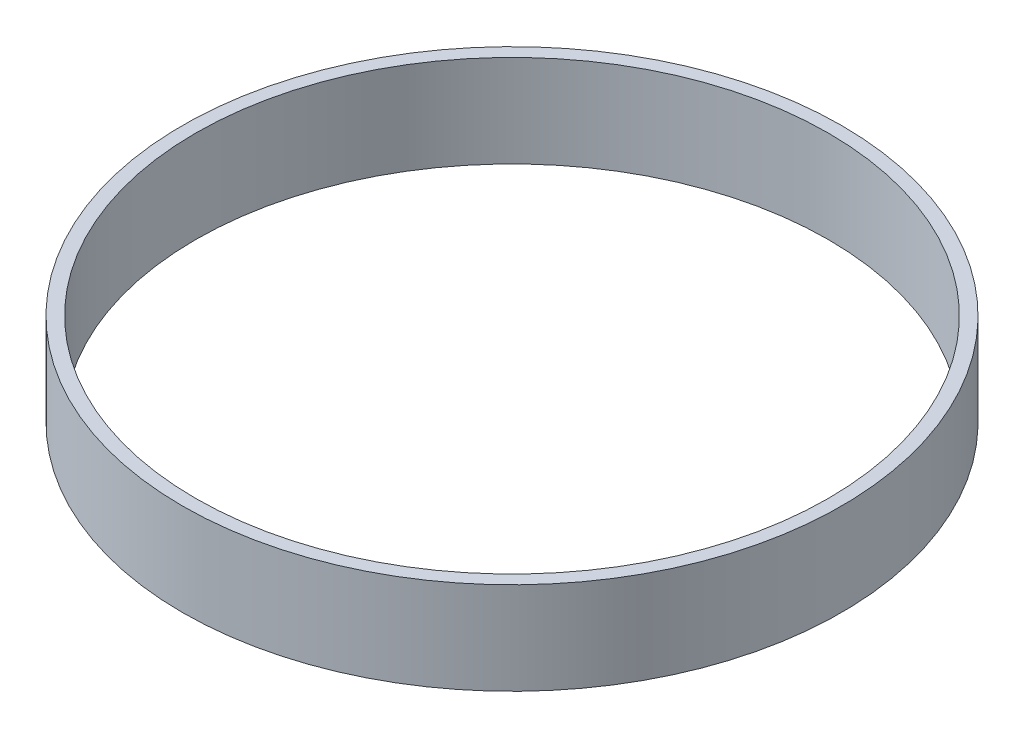
ISO-10303-21;
HEADER;
FILE_DESCRIPTION(('STEP AP214'),'2;1');
FILE_NAME('part.step','',(''),(''),'','','');
FILE_SCHEMA(('AUTOMOTIVE_DESIGN { 1 0 10303 214 1 1 1 1 }'));
ENDSEC;
DATA;
#1=APPLICATION_CONTEXT('core data for automotive mechanical design processes');
#2=APPLICATION_PROTOCOL_DEFINITION('international standard','automotive_design',2000,#1);
#3=PRODUCT_CONTEXT('',#1,'mechanical');
#4=PRODUCT('Part','Part','',(#3));
#5=PRODUCT_RELATED_PRODUCT_CATEGORY('part','',(#4));
#6=PRODUCT_DEFINITION_FORMATION('','',#4);
#7=PRODUCT_DEFINITION_CONTEXT('part definition',#1,'design');
#8=PRODUCT_DEFINITION('design','',#6,#7);
#9=PRODUCT_DEFINITION_SHAPE('','',#8);
#10=(LENGTH_UNIT() NAMED_UNIT(*) SI_UNIT(.MILLI.,.METRE.));
#11=(NAMED_UNIT(*) PLANE_ANGLE_UNIT() SI_UNIT($,.RADIAN.));
#12=(NAMED_UNIT(*) SI_UNIT($,.STERADIAN.) SOLID_ANGLE_UNIT());
#13=UNCERTAINTY_MEASURE_WITH_UNIT(LENGTH_MEASURE(1.E-05),#10,'distance_accuracy_value','');
#14=(GEOMETRIC_REPRESENTATION_CONTEXT(3) GLOBAL_UNCERTAINTY_ASSIGNED_CONTEXT((#13)) GLOBAL_UNIT_ASSIGNED_CONTEXT((#10,
#11,#12)) REPRESENTATION_CONTEXT('',''));
#15=CARTESIAN_POINT('',(0.,0.,0.));
#16=DIRECTION('',(0.,0.,1.));
#17=DIRECTION('',(1.,0.,0.));
#18=AXIS2_PLACEMENT_3D('',#15,#16,#17);
#19=CARTESIAN_POINT('',(0.,21.,0.));
#20=DIRECTION('',(0.,1.,0.));
#21=DIRECTION('',(0.,0.,1.));
#22=AXIS2_PLACEMENT_3D('',#19,#20,#21);
#23=PLANE('',#22);
#24=CARTESIAN_POINT('',(0.,21.,0.));
#25=DIRECTION('',(0.,1.,0.));
#26=DIRECTION('',(0.,0.,1.));
#27=AXIS2_PLACEMENT_3D('',#24,#25,#26);
#28=CIRCLE('',#27,75.);
#29=CARTESIAN_POINT('',(0.,21.,-75.));
#30=VERTEX_POINT('',#29);
#31=EDGE_CURVE('E10',#30,#30,#28,.T.);
#32=ORIENTED_EDGE('',*,*,#31,.T.);
#33=EDGE_LOOP('',(#32));
#34=FACE_BOUND('',#33,.T.);
#35=CARTESIAN_POINT('',(0.,21.,0.));
#36=DIRECTION('',(0.,1.,0.));
#37=DIRECTION('',(0.,0.,1.));
#38=AXIS2_PLACEMENT_3D('',#35,#36,#37);
#39=CIRCLE('',#38,72.);
#40=CARTESIAN_POINT('',(0.,21.,-72.));
#41=VERTEX_POINT('',#40);
#42=EDGE_CURVE('E42',#41,#41,#39,.T.);
#43=ORIENTED_EDGE('',*,*,#42,.F.);
#44=EDGE_LOOP('',(#43));
#45=FACE_BOUND('',#44,.T.);
#46=ADVANCED_FACE('F31',(#34,#45),#23,.T.);
#47=CARTESIAN_POINT('',(0.,0.,0.));
#48=DIRECTION('',(0.,1.,0.));
#49=DIRECTION('',(0.,0.,1.));
#50=AXIS2_PLACEMENT_3D('',#47,#48,#49);
#51=PLANE('',#50);
#52=CARTESIAN_POINT('',(0.,0.,0.));
#53=DIRECTION('',(0.,1.,0.));
#54=DIRECTION('',(0.,0.,1.));
#55=AXIS2_PLACEMENT_3D('',#52,#53,#54);
#56=CIRCLE('',#55,75.);
#57=CARTESIAN_POINT('',(0.,0.,-75.));
#58=VERTEX_POINT('',#57);
#59=EDGE_CURVE('E35',#58,#58,#56,.T.);
#60=ORIENTED_EDGE('',*,*,#59,.F.);
#61=EDGE_LOOP('',(#60));
#62=FACE_BOUND('',#61,.T.);
#63=CARTESIAN_POINT('',(0.,0.,0.));
#64=DIRECTION('',(0.,1.,0.));
#65=DIRECTION('',(0.,0.,1.));
#66=AXIS2_PLACEMENT_3D('',#63,#64,#65);
#67=CIRCLE('',#66,72.);
#68=CARTESIAN_POINT('',(0.,0.,-72.));
#69=VERTEX_POINT('',#68);
#70=EDGE_CURVE('E44',#69,#69,#67,.T.);
#71=ORIENTED_EDGE('',*,*,#70,.T.);
#72=EDGE_LOOP('',(#71));
#73=FACE_BOUND('',#72,.T.);
#74=ADVANCED_FACE('F54',(#62,#73),#51,.F.);
#75=CARTESIAN_POINT('',(0.,21.,0.));
#76=DIRECTION('',(0.,-1.,0.));
#77=DIRECTION('',(0.,0.,-1.));
#78=AXIS2_PLACEMENT_3D('',#75,#76,#77);
#79=CYLINDRICAL_SURFACE('',#78,75.);
#80=CARTESIAN_POINT('',(0.,21.,-75.));
#81=CARTESIAN_POINT('',(0.,20.78125,-75.));
#82=CARTESIAN_POINT('',(0.,20.5625,-75.));
#83=CARTESIAN_POINT('',(0.,20.125,-75.));
#84=CARTESIAN_POINT('',(0.,19.90625,-75.));
#85=CARTESIAN_POINT('',(0.,19.46875,-75.));
#86=CARTESIAN_POINT('',(0.,19.25,-75.));
#87=CARTESIAN_POINT('',(0.,18.8125,-75.));
#88=CARTESIAN_POINT('',(0.,18.59375,-75.));
#89=CARTESIAN_POINT('',(0.,18.15625,-75.));
#90=CARTESIAN_POINT('',(0.,17.9375,-75.));
#91=CARTESIAN_POINT('',(0.,17.5,-75.));
#92=CARTESIAN_POINT('',(0.,17.28125,-75.));
#93=CARTESIAN_POINT('',(0.,16.84375,-75.));
#94=CARTESIAN_POINT('',(0.,16.625,-75.));
#95=CARTESIAN_POINT('',(0.,16.1875,-75.));
#96=CARTESIAN_POINT('',(0.,15.96875,-75.));
#97=CARTESIAN_POINT('',(0.,15.53125,-75.));
#98=CARTESIAN_POINT('',(0.,15.3125,-75.));
#99=CARTESIAN_POINT('',(0.,14.875,-75.));
#100=CARTESIAN_POINT('',(0.,14.65625,-75.));
#101=CARTESIAN_POINT('',(0.,14.21875,-75.));
#102=CARTESIAN_POINT('',(0.,14.,-75.));
#103=CARTESIAN_POINT('',(0.,13.5625,-75.));
#104=CARTESIAN_POINT('',(0.,13.34375,-75.));
#105=CARTESIAN_POINT('',(0.,12.90625,-75.));
#106=CARTESIAN_POINT('',(0.,12.6875,-75.));
#107=CARTESIAN_POINT('',(0.,12.25,-75.));
#108=CARTESIAN_POINT('',(0.,12.03125,-75.));
#109=CARTESIAN_POINT('',(0.,11.59375,-75.));
#110=CARTESIAN_POINT('',(0.,11.375,-75.));
#111=CARTESIAN_POINT('',(0.,10.9375,-75.));
#112=CARTESIAN_POINT('',(0.,10.71875,-75.));
#113=CARTESIAN_POINT('',(0.,10.28125,-75.));
#114=CARTESIAN_POINT('',(0.,10.0625,-75.));
#115=CARTESIAN_POINT('',(0.,9.625,-75.));
#116=CARTESIAN_POINT('',(0.,9.40625,-75.));
#117=CARTESIAN_POINT('',(0.,8.96875,-75.));
#118=CARTESIAN_POINT('',(0.,8.75,-75.));
#119=CARTESIAN_POINT('',(0.,8.3125,-75.));
#120=CARTESIAN_POINT('',(0.,8.09375,-75.));
#121=CARTESIAN_POINT('',(0.,7.65625,-75.));
#122=CARTESIAN_POINT('',(0.,7.4375,-75.));
#123=CARTESIAN_POINT('',(0.,7.,-75.));
#124=CARTESIAN_POINT('',(0.,6.78125,-75.));
#125=CARTESIAN_POINT('',(0.,6.34375,-75.));
#126=CARTESIAN_POINT('',(0.,6.125,-75.));
#127=CARTESIAN_POINT('',(0.,5.6875,-75.));
#128=CARTESIAN_POINT('',(0.,5.46875,-75.));
#129=CARTESIAN_POINT('',(0.,5.03125,-75.));
#130=CARTESIAN_POINT('',(0.,4.8125,-75.));
#131=CARTESIAN_POINT('',(0.,4.375,-75.));
#132=CARTESIAN_POINT('',(0.,4.15625,-75.));
#133=CARTESIAN_POINT('',(0.,3.71875,-75.));
#134=CARTESIAN_POINT('',(0.,3.5,-75.));
#135=CARTESIAN_POINT('',(0.,3.0625,-75.));
#136=CARTESIAN_POINT('',(0.,2.84375,-75.));
#137=CARTESIAN_POINT('',(0.,2.40625,-75.));
#138=CARTESIAN_POINT('',(0.,2.1875,-75.));
#139=CARTESIAN_POINT('',(0.,1.75,-75.));
#140=CARTESIAN_POINT('',(0.,1.53125,-75.));
#141=CARTESIAN_POINT('',(0.,1.09375,-75.));
#142=CARTESIAN_POINT('',(0.,0.875000000000001,-75.));
#143=CARTESIAN_POINT('',(0.,0.4375,-75.));
#144=CARTESIAN_POINT('',(0.,0.21875,-75.));
#145=CARTESIAN_POINT('',(0.,0.,-75.));
#146=B_SPLINE_CURVE_WITH_KNOTS('',3,(#80,#81,#82,#83,#84,#85,#86,#87,#88,#89,#90,#91,#92,#93,
#94,#95,#96,#97,#98,#99,#100,#101,#102,#103,#104,#105,#106,#107,#108,#109,#110,#111,#112,#113,
#114,#115,#116,#117,#118,#119,#120,#121,#122,#123,#124,#125,#126,#127,#128,#129,#130,#131,#132,
#133,#134,#135,#136,#137,#138,#139,#140,#141,#142,#143,#144,#145),.UNSPECIFIED.,.F.,.F.,(4,2,2,
2,2,2,2,2,2,2,2,2,2,2,2,2,2,2,2,2,2,2,2,2,2,2,2,2,2,2,2,2,4),(0.,0.656250000000001,1.3125,
1.96875,2.625,3.28125,3.9375,4.59375,5.25,5.90625,6.5625,7.21875,7.875,8.53125,9.1875,9.84375,
10.5,11.15625,11.8125,12.46875,13.125,13.78125,14.4375,15.09375,15.75,16.40625,17.0625,17.71875,
18.375,19.03125,19.6875,20.34375,21.),.UNSPECIFIED.);
#147=EDGE_CURVE('BSEAM33',#30,#58,#146,.T.);
#148=ORIENTED_EDGE('',*,*,#31,.F.);
#149=ORIENTED_EDGE('',*,*,#59,.T.);
#150=ORIENTED_EDGE('',*,*,#147,.T.);
#151=ORIENTED_EDGE('',*,*,#147,.F.);
#152=EDGE_LOOP('',(#148,#150,#149,#151));
#153=FACE_BOUND('',#152,.T.);
#154=ADVANCED_FACE('F33',(#153),#79,.T.);
#155=CARTESIAN_POINT('',(0.,21.,0.));
#156=DIRECTION('',(0.,-1.,0.));
#157=DIRECTION('',(0.,0.,-1.));
#158=AXIS2_PLACEMENT_3D('',#155,#156,#157);
#159=CYLINDRICAL_SURFACE('',#158,72.);
#160=CARTESIAN_POINT('',(0.,21.,-72.));
#161=CARTESIAN_POINT('',(0.,20.78125,-72.));
#162=CARTESIAN_POINT('',(0.,20.5625,-72.));
#163=CARTESIAN_POINT('',(0.,20.125,-72.));
#164=CARTESIAN_POINT('',(0.,19.90625,-72.));
#165=CARTESIAN_POINT('',(0.,19.46875,-72.));
#166=CARTESIAN_POINT('',(0.,19.25,-72.));
#167=CARTESIAN_POINT('',(0.,18.8125,-72.));
#168=CARTESIAN_POINT('',(0.,18.59375,-72.));
#169=CARTESIAN_POINT('',(0.,18.15625,-72.));
#170=CARTESIAN_POINT('',(0.,17.9375,-72.));
#171=CARTESIAN_POINT('',(0.,17.5,-72.));
#172=CARTESIAN_POINT('',(0.,17.28125,-72.));
#173=CARTESIAN_POINT('',(0.,16.84375,-72.));
#174=CARTESIAN_POINT('',(0.,16.625,-72.));
#175=CARTESIAN_POINT('',(0.,16.1875,-72.));
#176=CARTESIAN_POINT('',(0.,15.96875,-72.));
#177=CARTESIAN_POINT('',(0.,15.53125,-72.));
#178=CARTESIAN_POINT('',(0.,15.3125,-72.));
#179=CARTESIAN_POINT('',(0.,14.875,-72.));
#180=CARTESIAN_POINT('',(0.,14.65625,-72.));
#181=CARTESIAN_POINT('',(0.,14.21875,-72.));
#182=CARTESIAN_POINT('',(0.,14.,-72.));
#183=CARTESIAN_POINT('',(0.,13.5625,-72.));
#184=CARTESIAN_POINT('',(0.,13.34375,-72.));
#185=CARTESIAN_POINT('',(0.,12.90625,-72.));
#186=CARTESIAN_POINT('',(0.,12.6875,-72.));
#187=CARTESIAN_POINT('',(0.,12.25,-72.));
#188=CARTESIAN_POINT('',(0.,12.03125,-72.));
#189=CARTESIAN_POINT('',(0.,11.59375,-72.));
#190=CARTESIAN_POINT('',(0.,11.375,-72.));
#191=CARTESIAN_POINT('',(0.,10.9375,-72.));
#192=CARTESIAN_POINT('',(0.,10.71875,-72.));
#193=CARTESIAN_POINT('',(0.,10.28125,-72.));
#194=CARTESIAN_POINT('',(0.,10.0625,-72.));
#195=CARTESIAN_POINT('',(0.,9.625,-72.));
#196=CARTESIAN_POINT('',(0.,9.40625,-72.));
#197=CARTESIAN_POINT('',(0.,8.96875,-72.));
#198=CARTESIAN_POINT('',(0.,8.75,-72.));
#199=CARTESIAN_POINT('',(0.,8.3125,-72.));
#200=CARTESIAN_POINT('',(0.,8.09375,-72.));
#201=CARTESIAN_POINT('',(0.,7.65625,-72.));
#202=CARTESIAN_POINT('',(0.,7.4375,-72.));
#203=CARTESIAN_POINT('',(0.,7.,-72.));
#204=CARTESIAN_POINT('',(0.,6.78125,-72.));
#205=CARTESIAN_POINT('',(0.,6.34375,-72.));
#206=CARTESIAN_POINT('',(0.,6.125,-72.));
#207=CARTESIAN_POINT('',(0.,5.6875,-72.));
#208=CARTESIAN_POINT('',(0.,5.46875,-72.));
#209=CARTESIAN_POINT('',(0.,5.03125,-72.));
#210=CARTESIAN_POINT('',(0.,4.8125,-72.));
#211=CARTESIAN_POINT('',(0.,4.375,-72.));
#212=CARTESIAN_POINT('',(0.,4.15625,-72.));
#213=CARTESIAN_POINT('',(0.,3.71875,-72.));
#214=CARTESIAN_POINT('',(0.,3.5,-72.));
#215=CARTESIAN_POINT('',(0.,3.0625,-72.));
#216=CARTESIAN_POINT('',(0.,2.84375,-72.));
#217=CARTESIAN_POINT('',(0.,2.40625,-72.));
#218=CARTESIAN_POINT('',(0.,2.1875,-72.));
#219=CARTESIAN_POINT('',(0.,1.75,-72.));
#220=CARTESIAN_POINT('',(0.,1.53125,-72.));
#221=CARTESIAN_POINT('',(0.,1.09375,-72.));
#222=CARTESIAN_POINT('',(0.,0.875000000000001,-72.));
#223=CARTESIAN_POINT('',(0.,0.4375,-72.));
#224=CARTESIAN_POINT('',(0.,0.21875,-72.));
#225=CARTESIAN_POINT('',(0.,0.,-72.));
#226=B_SPLINE_CURVE_WITH_KNOTS('',3,(#160,#161,#162,#163,#164,#165,#166,#167,#168,#169,#170,
#171,#172,#173,#174,#175,#176,#177,#178,#179,#180,#181,#182,#183,#184,#185,#186,#187,#188,#189,
#190,#191,#192,#193,#194,#195,#196,#197,#198,#199,#200,#201,#202,#203,#204,#205,#206,#207,#208,
#209,#210,#211,#212,#213,#214,#215,#216,#217,#218,#219,#220,#221,#222,#223,#224,#225),
.UNSPECIFIED.,.F.,.F.,(4,2,2,2,2,2,2,2,2,2,2,2,2,2,2,2,2,2,2,2,2,2,2,2,2,2,2,2,2,2,2,2,4),(0.,
0.656250000000001,1.3125,1.96875,2.625,3.28125,3.9375,4.59375,5.25,5.90625,6.5625,7.21875,7.875,
8.53125,9.1875,9.84375,10.5,11.15625,11.8125,12.46875,13.125,13.78125,14.4375,15.09375,15.75,
16.40625,17.0625,17.71875,18.375,19.03125,19.6875,20.34375,21.),.UNSPECIFIED.);
#227=EDGE_CURVE('BSEAM50',#41,#69,#226,.T.);
#228=ORIENTED_EDGE('',*,*,#42,.T.);
#229=ORIENTED_EDGE('',*,*,#70,.F.);
#230=ORIENTED_EDGE('',*,*,#227,.T.);
#231=ORIENTED_EDGE('',*,*,#227,.F.);
#232=EDGE_LOOP('',(#228,#230,#229,#231));
#233=FACE_BOUND('',#232,.T.);
#234=ADVANCED_FACE('F50',(#233),#159,.F.);
#235=CLOSED_SHELL('',(#46,#74,#154,#234));
#236=MANIFOLD_SOLID_BREP('B2',#235);
#237=ADVANCED_BREP_SHAPE_REPRESENTATION('',(#18,#236),#14);
#238=SHAPE_DEFINITION_REPRESENTATION(#9,#237);
ENDSEC;
END-ISO-10303-21;
